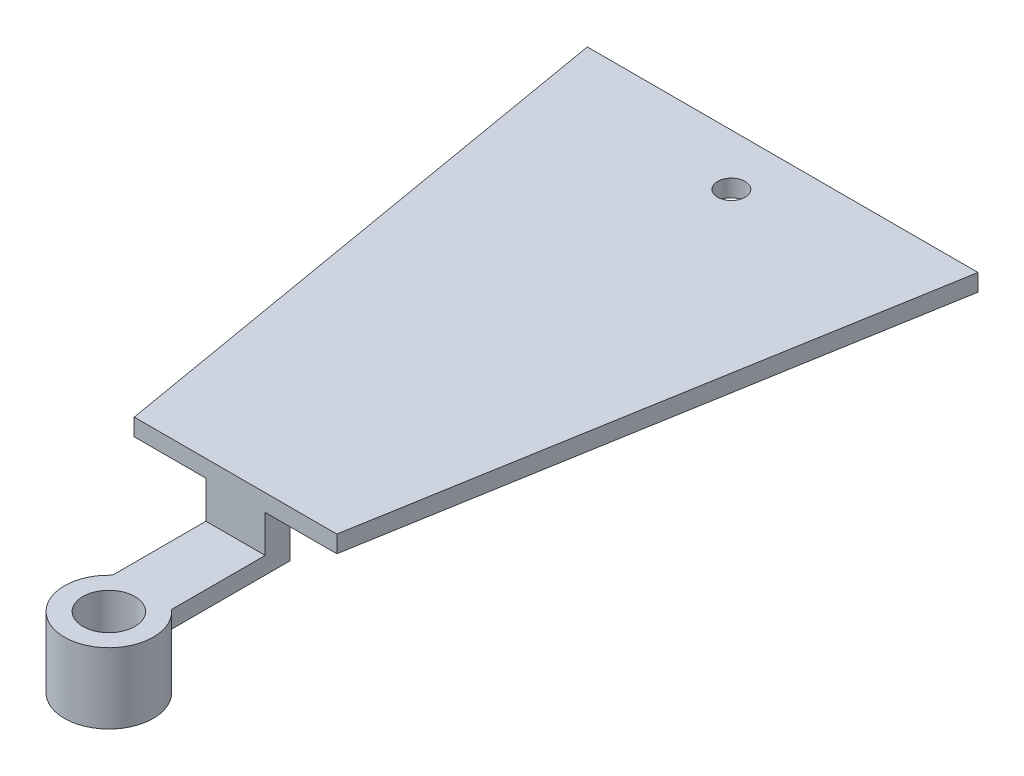
ISO-10303-21;
HEADER;
FILE_DESCRIPTION(('STEP AP214'),'2;1');
FILE_NAME('part.step','',(''),(''),'','','');
FILE_SCHEMA(('AUTOMOTIVE_DESIGN { 1 0 10303 214 1 1 1 1 }'));
ENDSEC;
DATA;
#1=APPLICATION_CONTEXT('core data for automotive mechanical design processes');
#2=APPLICATION_PROTOCOL_DEFINITION('international standard','automotive_design',2000,#1);
#3=PRODUCT_CONTEXT('',#1,'mechanical');
#4=PRODUCT('Part','Part','',(#3));
#5=PRODUCT_RELATED_PRODUCT_CATEGORY('part','',(#4));
#6=PRODUCT_DEFINITION_FORMATION('','',#4);
#7=PRODUCT_DEFINITION_CONTEXT('part definition',#1,'design');
#8=PRODUCT_DEFINITION('design','',#6,#7);
#9=PRODUCT_DEFINITION_SHAPE('','',#8);
#10=(LENGTH_UNIT() NAMED_UNIT(*) SI_UNIT(.MILLI.,.METRE.));
#11=(NAMED_UNIT(*) PLANE_ANGLE_UNIT() SI_UNIT($,.RADIAN.));
#12=(NAMED_UNIT(*) SI_UNIT($,.STERADIAN.) SOLID_ANGLE_UNIT());
#13=UNCERTAINTY_MEASURE_WITH_UNIT(LENGTH_MEASURE(1.E-05),#10,'distance_accuracy_value','');
#14=(GEOMETRIC_REPRESENTATION_CONTEXT(3) GLOBAL_UNCERTAINTY_ASSIGNED_CONTEXT((#13)) GLOBAL_UNIT_ASSIGNED_CONTEXT((#10,
#11,#12)) REPRESENTATION_CONTEXT('',''));
#15=CARTESIAN_POINT('',(0.,0.,0.));
#16=DIRECTION('',(0.,0.,1.));
#17=DIRECTION('',(1.,0.,0.));
#18=AXIS2_PLACEMENT_3D('',#15,#16,#17);
#19=CARTESIAN_POINT('',(10.,53.081,105.6));
#20=DIRECTION('',(0.,1.,0.));
#21=DIRECTION('',(0.,0.,1.));
#22=AXIS2_PLACEMENT_3D('',#19,#20,#21);
#23=PLANE('',#22);
#24=DIRECTION('',(1.,0.,0.));
#25=VECTOR('',#24,1.);
#26=CARTESIAN_POINT('',(4.5,53.081,82.075));
#27=LINE('',#26,#25);
#28=CARTESIAN_POINT('',(4.50000000000001,53.081,82.075));
#29=VERTEX_POINT('',#28);
#30=CARTESIAN_POINT('',(15.5,53.081,82.075));
#31=VERTEX_POINT('',#30);
#32=EDGE_CURVE('E49',#29,#31,#27,.T.);
#33=ORIENTED_EDGE('',*,*,#32,.F.);
#34=DIRECTION('',(0.,0.,1.));
#35=VECTOR('',#34,1.);
#36=CARTESIAN_POINT('',(4.50000000000001,53.081,99.4441064824024));
#37=LINE('',#36,#35);
#38=CARTESIAN_POINT('',(4.50000000000001,53.081,99.4441064824024));
#39=VERTEX_POINT('',#38);
#40=EDGE_CURVE('E53',#29,#39,#37,.T.);
#41=ORIENTED_EDGE('',*,*,#40,.T.);
#42=CARTESIAN_POINT('',(10.,53.081,105.6));
#43=DIRECTION('',(0.,1.,0.));
#44=DIRECTION('',(0.,0.,1.));
#45=AXIS2_PLACEMENT_3D('',#42,#43,#44);
#46=CIRCLE('',#45,8.255);
#47=CARTESIAN_POINT('',(15.5,53.081,99.4441064824024));
#48=VERTEX_POINT('',#47);
#49=EDGE_CURVE('E42',#39,#48,#46,.T.);
#50=ORIENTED_EDGE('',*,*,#49,.T.);
#51=DIRECTION('',(0.,0.,-1.));
#52=VECTOR('',#51,1.);
#53=CARTESIAN_POINT('',(15.5,53.081,99.4441064824024));
#54=LINE('',#53,#52);
#55=EDGE_CURVE('E177',#48,#31,#54,.T.);
#56=ORIENTED_EDGE('',*,*,#55,.T.);
#57=EDGE_LOOP('',(#33,#41,#50,#56));
#58=FACE_BOUND('',#57,.T.);
#59=CARTESIAN_POINT('',(10.,53.081,105.6));
#60=DIRECTION('',(0.,1.,0.));
#61=DIRECTION('',(0.,0.,1.));
#62=AXIS2_PLACEMENT_3D('',#59,#60,#61);
#63=CIRCLE('',#62,4.82599999999999);
#64=CARTESIAN_POINT('',(10.,53.081,110.426));
#65=VERTEX_POINT('',#64);
#66=EDGE_CURVE('E196',#65,#65,#63,.T.);
#67=ORIENTED_EDGE('',*,*,#66,.F.);
#68=EDGE_LOOP('',(#67));
#69=FACE_BOUND('',#68,.T.);
#70=ADVANCED_FACE('F34',(#58,#69),#23,.T.);
#71=CARTESIAN_POINT('',(10.,40.,105.6));
#72=DIRECTION('',(0.,1.,0.));
#73=DIRECTION('',(0.,0.,1.));
#74=AXIS2_PLACEMENT_3D('',#71,#72,#73);
#75=PLANE('',#74);
#76=CARTESIAN_POINT('',(10.,40.,105.6));
#77=DIRECTION('',(0.,1.,0.));
#78=DIRECTION('',(0.,0.,1.));
#79=AXIS2_PLACEMENT_3D('',#76,#77,#78);
#80=CIRCLE('',#79,8.255);
#81=CARTESIAN_POINT('',(10.,40.,113.855));
#82=VERTEX_POINT('',#81);
#83=EDGE_CURVE('E199',#82,#82,#80,.T.);
#84=ORIENTED_EDGE('',*,*,#83,.F.);
#85=EDGE_LOOP('',(#84));
#86=FACE_BOUND('',#85,.T.);
#87=CARTESIAN_POINT('',(10.,40.,105.6));
#88=DIRECTION('',(0.,1.,0.));
#89=DIRECTION('',(0.,0.,1.));
#90=AXIS2_PLACEMENT_3D('',#87,#88,#89);
#91=CIRCLE('',#90,4.82599999999999);
#92=CARTESIAN_POINT('',(10.,40.,110.426));
#93=VERTEX_POINT('',#92);
#94=EDGE_CURVE('E188',#93,#93,#91,.T.);
#95=ORIENTED_EDGE('',*,*,#94,.T.);
#96=EDGE_LOOP('',(#95));
#97=FACE_BOUND('',#96,.T.);
#98=ADVANCED_FACE('F206',(#86,#97),#75,.F.);
#99=CARTESIAN_POINT('',(10.,53.081,105.6));
#100=DIRECTION('',(0.,-1.,0.));
#101=DIRECTION('',(0.,0.,-1.));
#102=AXIS2_PLACEMENT_3D('',#99,#100,#101);
#103=CYLINDRICAL_SURFACE('',#102,8.255);
#104=ORIENTED_EDGE('',*,*,#49,.F.);
#105=DIRECTION('',(0.,1.,0.));
#106=VECTOR('',#105,1.);
#107=CARTESIAN_POINT('',(4.50000000000001,49.906,99.4441064824024));
#108=LINE('',#107,#106);
#109=CARTESIAN_POINT('',(4.50000000000001,49.906,99.4441064824024));
#110=VERTEX_POINT('',#109);
#111=EDGE_CURVE('E183',#110,#39,#108,.T.);
#112=ORIENTED_EDGE('',*,*,#111,.F.);
#113=CARTESIAN_POINT('',(10.,49.906,105.6));
#114=DIRECTION('',(0.,-1.,0.));
#115=DIRECTION('',(0.,0.,-1.));
#116=AXIS2_PLACEMENT_3D('',#113,#114,#115);
#117=CIRCLE('',#116,8.255);
#118=CARTESIAN_POINT('',(15.5,49.906,99.4441064824024));
#119=VERTEX_POINT('',#118);
#120=EDGE_CURVE('E11',#110,#119,#117,.T.);
#121=ORIENTED_EDGE('',*,*,#120,.T.);
#122=DIRECTION('',(0.,1.,0.));
#123=VECTOR('',#122,1.);
#124=CARTESIAN_POINT('',(15.5,49.906,99.4441064824024));
#125=LINE('',#124,#123);
#126=EDGE_CURVE('E192',#119,#48,#125,.T.);
#127=ORIENTED_EDGE('',*,*,#126,.T.);
#128=EDGE_LOOP('',(#104,#112,#121,#127));
#129=FACE_BOUND('',#128,.T.);
#130=ORIENTED_EDGE('',*,*,#83,.T.);
#131=EDGE_LOOP('',(#130));
#132=FACE_BOUND('',#131,.T.);
#133=ADVANCED_FACE('F36',(#129,#132),#103,.T.);
#134=CARTESIAN_POINT('',(10.,53.081,105.6));
#135=DIRECTION('',(0.,-1.,0.));
#136=DIRECTION('',(0.,0.,-1.));
#137=AXIS2_PLACEMENT_3D('',#134,#135,#136);
#138=CYLINDRICAL_SURFACE('',#137,4.82599999999999);
#139=ORIENTED_EDGE('',*,*,#66,.T.);
#140=EDGE_LOOP('',(#139));
#141=FACE_BOUND('',#140,.T.);
#142=ORIENTED_EDGE('',*,*,#94,.F.);
#143=EDGE_LOOP('',(#142));
#144=FACE_BOUND('',#143,.T.);
#145=ADVANCED_FACE('F211',(#141,#144),#138,.F.);
#146=CARTESIAN_POINT('',(4.50000000000001,49.906,99.4441064824024));
#147=DIRECTION('',(-1.,0.,0.));
#148=DIRECTION('',(0.,0.,1.));
#149=AXIS2_PLACEMENT_3D('',#146,#147,#148);
#150=PLANE('',#149);
#151=ORIENTED_EDGE('',*,*,#40,.F.);
#152=DIRECTION('',(0.,-1.,0.));
#153=VECTOR('',#152,1.);
#154=CARTESIAN_POINT('',(4.5,71.9350397892645,82.075));
#155=LINE('',#154,#153);
#156=CARTESIAN_POINT('',(4.5,60.,82.075));
#157=VERTEX_POINT('',#156);
#158=EDGE_CURVE('E120',#157,#29,#155,.T.);
#159=ORIENTED_EDGE('',*,*,#158,.F.);
#160=DIRECTION('',(0.,0.,1.));
#161=VECTOR('',#160,1.);
#162=CARTESIAN_POINT('',(4.50000000000001,60.,77.4441064824024));
#163=LINE('',#162,#161);
#164=CARTESIAN_POINT('',(4.50000000000001,60.,77.4441064824024));
#165=VERTEX_POINT('',#164);
#166=EDGE_CURVE('E163',#165,#157,#163,.T.);
#167=ORIENTED_EDGE('',*,*,#166,.F.);
#168=DIRECTION('',(0.,1.,0.));
#169=VECTOR('',#168,1.);
#170=CARTESIAN_POINT('',(4.50000000000001,49.906,77.4441064824024));
#171=LINE('',#170,#169);
#172=CARTESIAN_POINT('',(4.50000000000001,49.906,77.4441064824024));
#173=VERTEX_POINT('',#172);
#174=EDGE_CURVE('E186',#173,#165,#171,.T.);
#175=ORIENTED_EDGE('',*,*,#174,.F.);
#176=DIRECTION('',(0.,0.,1.));
#177=VECTOR('',#176,1.);
#178=CARTESIAN_POINT('',(4.50000000000001,49.906,99.4441064824024));
#179=LINE('',#178,#177);
#180=EDGE_CURVE('E173',#173,#110,#179,.T.);
#181=ORIENTED_EDGE('',*,*,#180,.T.);
#182=ORIENTED_EDGE('',*,*,#111,.T.);
#183=EDGE_LOOP('',(#151,#159,#167,#175,#181,#182));
#184=FACE_BOUND('',#183,.T.);
#185=ADVANCED_FACE('F213',(#184),#150,.T.);
#186=CARTESIAN_POINT('',(4.50000000000001,49.906,77.4441064824024));
#187=DIRECTION('',(0.,0.,-1.));
#188=DIRECTION('',(-1.,0.,0.));
#189=AXIS2_PLACEMENT_3D('',#186,#187,#188);
#190=PLANE('',#189);
#191=ORIENTED_EDGE('',*,*,#174,.T.);
#192=DIRECTION('',(-1.,0.,0.));
#193=VECTOR('',#192,1.);
#194=CARTESIAN_POINT('',(15.5,60.,77.4441064824024));
#195=LINE('',#194,#193);
#196=CARTESIAN_POINT('',(15.5,60.,77.4441064824024));
#197=VERTEX_POINT('',#196);
#198=EDGE_CURVE('E166',#197,#165,#195,.T.);
#199=ORIENTED_EDGE('',*,*,#198,.F.);
#200=DIRECTION('',(0.,1.,0.));
#201=VECTOR('',#200,1.);
#202=CARTESIAN_POINT('',(15.5,49.906,77.4441064824024));
#203=LINE('',#202,#201);
#204=CARTESIAN_POINT('',(15.5,49.906,77.4441064824024));
#205=VERTEX_POINT('',#204);
#206=EDGE_CURVE('E189',#205,#197,#203,.T.);
#207=ORIENTED_EDGE('',*,*,#206,.F.);
#208=DIRECTION('',(-1.,0.,0.));
#209=VECTOR('',#208,1.);
#210=CARTESIAN_POINT('',(4.50000000000001,49.906,77.4441064824024));
#211=LINE('',#210,#209);
#212=EDGE_CURVE('E180',#205,#173,#211,.T.);
#213=ORIENTED_EDGE('',*,*,#212,.T.);
#214=EDGE_LOOP('',(#191,#199,#207,#213));
#215=FACE_BOUND('',#214,.T.);
#216=ADVANCED_FACE('F220',(#215),#190,.T.);
#217=CARTESIAN_POINT('',(15.5,49.906,99.4441064824024));
#218=DIRECTION('',(1.,0.,0.));
#219=DIRECTION('',(0.,0.,-1.));
#220=AXIS2_PLACEMENT_3D('',#217,#218,#219);
#221=PLANE('',#220);
#222=ORIENTED_EDGE('',*,*,#55,.F.);
#223=ORIENTED_EDGE('',*,*,#126,.F.);
#224=DIRECTION('',(0.,0.,-1.));
#225=VECTOR('',#224,1.);
#226=CARTESIAN_POINT('',(15.5,49.906,99.4441064824024));
#227=LINE('',#226,#225);
#228=EDGE_CURVE('E176',#119,#205,#227,.T.);
#229=ORIENTED_EDGE('',*,*,#228,.T.);
#230=ORIENTED_EDGE('',*,*,#206,.T.);
#231=DIRECTION('',(0.,0.,-1.));
#232=VECTOR('',#231,1.);
#233=CARTESIAN_POINT('',(15.5,60.,82.075));
#234=LINE('',#233,#232);
#235=CARTESIAN_POINT('',(15.5,60.,82.075));
#236=VERTEX_POINT('',#235);
#237=EDGE_CURVE('E160',#236,#197,#234,.T.);
#238=ORIENTED_EDGE('',*,*,#237,.F.);
#239=DIRECTION('',(0.,-1.,0.));
#240=VECTOR('',#239,1.);
#241=CARTESIAN_POINT('',(15.5,71.9350397892645,82.075));
#242=LINE('',#241,#240);
#243=EDGE_CURVE('E159',#236,#31,#242,.T.);
#244=ORIENTED_EDGE('',*,*,#243,.T.);
#245=EDGE_LOOP('',(#222,#223,#229,#230,#238,#244));
#246=FACE_BOUND('',#245,.T.);
#247=ADVANCED_FACE('F264',(#246),#221,.T.);
#248=CARTESIAN_POINT('',(0.,49.906,0.));
#249=DIRECTION('',(0.,-1.,0.));
#250=DIRECTION('',(0.,0.,-1.));
#251=AXIS2_PLACEMENT_3D('',#248,#249,#250);
#252=PLANE('',#251);
#253=ORIENTED_EDGE('',*,*,#120,.F.);
#254=ORIENTED_EDGE('',*,*,#180,.F.);
#255=ORIENTED_EDGE('',*,*,#212,.F.);
#256=ORIENTED_EDGE('',*,*,#228,.F.);
#257=EDGE_LOOP('',(#253,#254,#255,#256));
#258=FACE_BOUND('',#257,.T.);
#259=ADVANCED_FACE('F277',(#258),#252,.T.);
#260=CARTESIAN_POINT('',(4.5,71.9350397892645,82.075));
#261=DIRECTION('',(0.,0.,-1.));
#262=DIRECTION('',(-1.,0.,0.));
#263=AXIS2_PLACEMENT_3D('',#260,#261,#262);
#264=PLANE('',#263);
#265=ORIENTED_EDGE('',*,*,#243,.F.);
#266=DIRECTION('',(1.,0.,0.));
#267=VECTOR('',#266,1.);
#268=CARTESIAN_POINT('',(0.,60.,82.075));
#269=LINE('',#268,#267);
#270=CARTESIAN_POINT('',(28.8104029614294,60.,82.075));
#271=VERTEX_POINT('',#270);
#272=EDGE_CURVE('E138',#236,#271,#269,.T.);
#273=ORIENTED_EDGE('',*,*,#272,.T.);
#274=DIRECTION('',(0.,-1.,0.));
#275=VECTOR('',#274,1.);
#276=CARTESIAN_POINT('',(28.8104029614294,63.175,82.075));
#277=LINE('',#276,#275);
#278=CARTESIAN_POINT('',(28.8104029614294,63.175,82.075));
#279=VERTEX_POINT('',#278);
#280=EDGE_CURVE('E146',#279,#271,#277,.T.);
#281=ORIENTED_EDGE('',*,*,#280,.F.);
#282=DIRECTION('',(1.,0.,0.));
#283=VECTOR('',#282,1.);
#284=CARTESIAN_POINT('',(0.,63.175,82.075));
#285=LINE('',#284,#283);
#286=CARTESIAN_POINT('',(-8.8104029614294,63.175,82.075));
#287=VERTEX_POINT('',#286);
#288=EDGE_CURVE('E133',#287,#279,#285,.T.);
#289=ORIENTED_EDGE('',*,*,#288,.F.);
#290=DIRECTION('',(0.,-1.,0.));
#291=VECTOR('',#290,1.);
#292=CARTESIAN_POINT('',(-8.8104029614294,63.175,82.075));
#293=LINE('',#292,#291);
#294=CARTESIAN_POINT('',(-8.8104029614294,60.,82.075));
#295=VERTEX_POINT('',#294);
#296=EDGE_CURVE('E154',#287,#295,#293,.T.);
#297=ORIENTED_EDGE('',*,*,#296,.T.);
#298=EDGE_CURVE('E135',#295,#157,#269,.T.);
#299=ORIENTED_EDGE('',*,*,#298,.T.);
#300=ORIENTED_EDGE('',*,*,#158,.T.);
#301=ORIENTED_EDGE('',*,*,#32,.T.);
#302=EDGE_LOOP('',(#265,#273,#281,#289,#297,#299,#300,#301));
#303=FACE_BOUND('',#302,.T.);
#304=ADVANCED_FACE('F291',(#303),#264,.F.);
#305=CARTESIAN_POINT('',(0.,60.,0.));
#306=DIRECTION('',(0.,1.,0.));
#307=DIRECTION('',(0.,0.,1.));
#308=AXIS2_PLACEMENT_3D('',#305,#306,#307);
#309=PLANE('',#308);
#310=CARTESIAN_POINT('',(10.,60.,-10.));
#311=DIRECTION('',(0.,1.,0.));
#312=DIRECTION('',(0.,0.,1.));
#313=AXIS2_PLACEMENT_3D('',#310,#311,#312);
#314=CIRCLE('',#313,2.5527);
#315=CARTESIAN_POINT('',(10.,60.,-7.4473));
#316=VERTEX_POINT('',#315);
#317=EDGE_CURVE('E149',#316,#316,#314,.T.);
#318=ORIENTED_EDGE('',*,*,#317,.T.);
#319=EDGE_LOOP('',(#318));
#320=FACE_BOUND('',#319,.T.);
#321=ORIENTED_EDGE('',*,*,#198,.T.);
#322=ORIENTED_EDGE('',*,*,#166,.T.);
#323=ORIENTED_EDGE('',*,*,#298,.F.);
#324=DIRECTION('',(0.169399207883059,0.,0.985547517052624));
#325=VECTOR('',#324,1.);
#326=CARTESIAN_POINT('',(-22.2600795884186,60.,3.82613702987048));
#327=LINE('',#326,#325);
#328=CARTESIAN_POINT('',(-26.2737512253363,60.,-19.525));
#329=VERTEX_POINT('',#328);
#330=EDGE_CURVE('E151',#329,#295,#327,.T.);
#331=ORIENTED_EDGE('',*,*,#330,.F.);
#332=DIRECTION('',(-1.,0.,0.));
#333=VECTOR('',#332,1.);
#334=CARTESIAN_POINT('',(0.,60.,-19.525));
#335=LINE('',#334,#333);
#336=CARTESIAN_POINT('',(46.2737512253363,60.,-19.525));
#337=VERTEX_POINT('',#336);
#338=EDGE_CURVE('E148',#337,#329,#335,.T.);
#339=ORIENTED_EDGE('',*,*,#338,.F.);
#340=DIRECTION('',(-0.169399207883058,0.,0.985547517052624));
#341=VECTOR('',#340,1.);
#342=CARTESIAN_POINT('',(41.6861577557905,60.,7.16515640426706));
#343=LINE('',#342,#341);
#344=EDGE_CURVE('E117',#337,#271,#343,.T.);
#345=ORIENTED_EDGE('',*,*,#344,.T.);
#346=ORIENTED_EDGE('',*,*,#272,.F.);
#347=ORIENTED_EDGE('',*,*,#237,.T.);
#348=EDGE_LOOP('',(#321,#322,#323,#331,#339,#345,#346,#347));
#349=FACE_BOUND('',#348,.T.);
#350=ADVANCED_FACE('F301',(#320,#349),#309,.F.);
#351=CARTESIAN_POINT('',(41.6861577557905,63.175,7.16515640426706));
#352=DIRECTION('',(0.985547517052624,0.,0.169399207883058));
#353=DIRECTION('',(0.169399207883058,0.,-0.985547517052624));
#354=AXIS2_PLACEMENT_3D('',#351,#352,#353);
#355=PLANE('',#354);
#356=ORIENTED_EDGE('',*,*,#344,.F.);
#357=DIRECTION('',(0.,-1.,0.));
#358=VECTOR('',#357,1.);
#359=CARTESIAN_POINT('',(46.2737512253363,63.175,-19.525));
#360=LINE('',#359,#358);
#361=CARTESIAN_POINT('',(46.2737512253363,63.175,-19.525));
#362=VERTEX_POINT('',#361);
#363=EDGE_CURVE('E110',#362,#337,#360,.T.);
#364=ORIENTED_EDGE('',*,*,#363,.F.);
#365=DIRECTION('',(-0.169399207883058,0.,0.985547517052624));
#366=VECTOR('',#365,1.);
#367=CARTESIAN_POINT('',(41.6861577557905,63.175,7.16515640426706));
#368=LINE('',#367,#366);
#369=EDGE_CURVE('E115',#362,#279,#368,.T.);
#370=ORIENTED_EDGE('',*,*,#369,.T.);
#371=ORIENTED_EDGE('',*,*,#280,.T.);
#372=EDGE_LOOP('',(#356,#364,#370,#371));
#373=FACE_BOUND('',#372,.T.);
#374=ADVANCED_FACE('F112',(#373),#355,.T.);
#375=CARTESIAN_POINT('',(0.,63.175,-19.525));
#376=DIRECTION('',(0.,0.,1.));
#377=DIRECTION('',(1.,0.,0.));
#378=AXIS2_PLACEMENT_3D('',#375,#376,#377);
#379=PLANE('',#378);
#380=ORIENTED_EDGE('',*,*,#338,.T.);
#381=DIRECTION('',(0.,-1.,0.));
#382=VECTOR('',#381,1.);
#383=CARTESIAN_POINT('',(-26.2737512253363,63.175,-19.525));
#384=LINE('',#383,#382);
#385=CARTESIAN_POINT('',(-26.2737512253363,63.175,-19.525));
#386=VERTEX_POINT('',#385);
#387=EDGE_CURVE('E121',#386,#329,#384,.T.);
#388=ORIENTED_EDGE('',*,*,#387,.F.);
#389=DIRECTION('',(-1.,0.,0.));
#390=VECTOR('',#389,1.);
#391=CARTESIAN_POINT('',(0.,63.175,-19.525));
#392=LINE('',#391,#390);
#393=EDGE_CURVE('E124',#362,#386,#392,.T.);
#394=ORIENTED_EDGE('',*,*,#393,.F.);
#395=ORIENTED_EDGE('',*,*,#363,.T.);
#396=EDGE_LOOP('',(#380,#388,#394,#395));
#397=FACE_BOUND('',#396,.T.);
#398=ADVANCED_FACE('F125',(#397),#379,.F.);
#399=CARTESIAN_POINT('',(-22.2600795884186,63.175,3.82613702987048));
#400=DIRECTION('',(0.985547517052624,0.,-0.169399207883059));
#401=DIRECTION('',(-0.169399207883059,0.,-0.985547517052624));
#402=AXIS2_PLACEMENT_3D('',#399,#400,#401);
#403=PLANE('',#402);
#404=ORIENTED_EDGE('',*,*,#330,.T.);
#405=ORIENTED_EDGE('',*,*,#296,.F.);
#406=DIRECTION('',(0.169399207883059,0.,0.985547517052624));
#407=VECTOR('',#406,1.);
#408=CARTESIAN_POINT('',(-22.2600795884186,63.175,3.82613702987048));
#409=LINE('',#408,#407);
#410=EDGE_CURVE('E129',#386,#287,#409,.T.);
#411=ORIENTED_EDGE('',*,*,#410,.F.);
#412=ORIENTED_EDGE('',*,*,#387,.T.);
#413=EDGE_LOOP('',(#404,#405,#411,#412));
#414=FACE_BOUND('',#413,.T.);
#415=ADVANCED_FACE('F330',(#414),#403,.F.);
#416=CARTESIAN_POINT('',(0.,63.175,0.));
#417=DIRECTION('',(0.,1.,0.));
#418=DIRECTION('',(0.,0.,1.));
#419=AXIS2_PLACEMENT_3D('',#416,#417,#418);
#420=PLANE('',#419);
#421=CARTESIAN_POINT('',(10.,63.175,-10.));
#422=DIRECTION('',(0.,1.,0.));
#423=DIRECTION('',(0.,0.,1.));
#424=AXIS2_PLACEMENT_3D('',#421,#422,#423);
#425=CIRCLE('',#424,2.5527);
#426=CARTESIAN_POINT('',(10.,63.175,-7.4473));
#427=VERTEX_POINT('',#426);
#428=EDGE_CURVE('E141',#427,#427,#425,.T.);
#429=ORIENTED_EDGE('',*,*,#428,.F.);
#430=EDGE_LOOP('',(#429));
#431=FACE_BOUND('',#430,.T.);
#432=ORIENTED_EDGE('',*,*,#369,.F.);
#433=ORIENTED_EDGE('',*,*,#393,.T.);
#434=ORIENTED_EDGE('',*,*,#410,.T.);
#435=ORIENTED_EDGE('',*,*,#288,.T.);
#436=EDGE_LOOP('',(#432,#433,#434,#435));
#437=FACE_BOUND('',#436,.T.);
#438=ADVANCED_FACE('F131',(#431,#437),#420,.T.);
#439=CARTESIAN_POINT('',(10.,60.,-10.));
#440=DIRECTION('',(0.,1.,0.));
#441=DIRECTION('',(0.,0.,1.));
#442=AXIS2_PLACEMENT_3D('',#439,#440,#441);
#443=CYLINDRICAL_SURFACE('',#442,2.5527);
#444=ORIENTED_EDGE('',*,*,#317,.F.);
#445=EDGE_LOOP('',(#444));
#446=FACE_BOUND('',#445,.T.);
#447=ORIENTED_EDGE('',*,*,#428,.T.);
#448=EDGE_LOOP('',(#447));
#449=FACE_BOUND('',#448,.T.);
#450=ADVANCED_FACE('F348',(#446,#449),#443,.F.);
#451=CLOSED_SHELL('',(#70,#98,#133,#145,#185,#216,#247,#259,#304,#350,#374,#398,#415,#438,#450));
#452=MANIFOLD_SOLID_BREP('B2',#451);
#453=ADVANCED_BREP_SHAPE_REPRESENTATION('',(#18,#452),#14);
#454=SHAPE_DEFINITION_REPRESENTATION(#9,#453);
ENDSEC;
END-ISO-10303-21;
